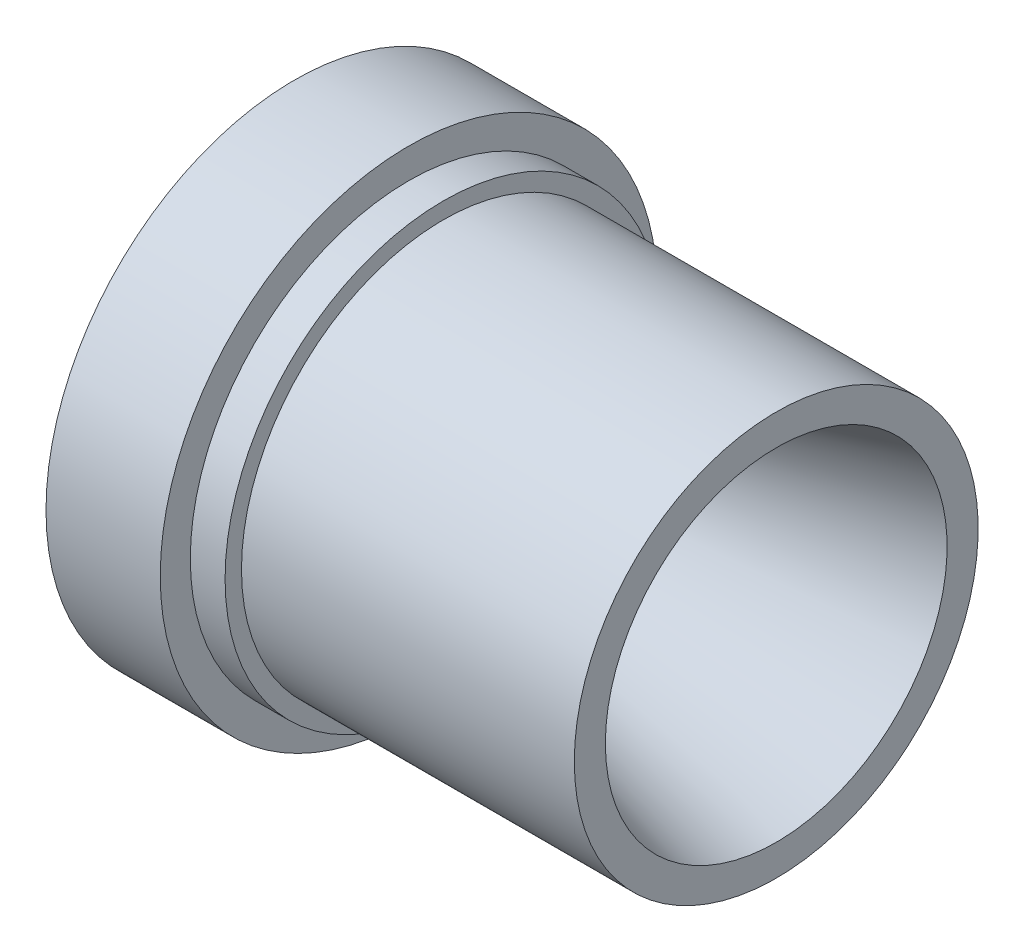
ISO-10303-21;
HEADER;
FILE_DESCRIPTION(('STEP AP214'),'2;1');
FILE_NAME('part.step','',(''),(''),'','','');
FILE_SCHEMA(('AUTOMOTIVE_DESIGN { 1 0 10303 214 1 1 1 1 }'));
ENDSEC;
DATA;
#1=APPLICATION_CONTEXT('core data for automotive mechanical design processes');
#2=APPLICATION_PROTOCOL_DEFINITION('international standard','automotive_design',2000,#1);
#3=PRODUCT_CONTEXT('',#1,'mechanical');
#4=PRODUCT('Part','Part','',(#3));
#5=PRODUCT_RELATED_PRODUCT_CATEGORY('part','',(#4));
#6=PRODUCT_DEFINITION_FORMATION('','',#4);
#7=PRODUCT_DEFINITION_CONTEXT('part definition',#1,'design');
#8=PRODUCT_DEFINITION('design','',#6,#7);
#9=PRODUCT_DEFINITION_SHAPE('','',#8);
#10=(LENGTH_UNIT() NAMED_UNIT(*) SI_UNIT(.MILLI.,.METRE.));
#11=(NAMED_UNIT(*) PLANE_ANGLE_UNIT() SI_UNIT($,.RADIAN.));
#12=(NAMED_UNIT(*) SI_UNIT($,.STERADIAN.) SOLID_ANGLE_UNIT());
#13=UNCERTAINTY_MEASURE_WITH_UNIT(LENGTH_MEASURE(1.E-05),#10,'distance_accuracy_value','');
#14=(GEOMETRIC_REPRESENTATION_CONTEXT(3) GLOBAL_UNCERTAINTY_ASSIGNED_CONTEXT((#13)) GLOBAL_UNIT_ASSIGNED_CONTEXT((#10,
#11,#12)) REPRESENTATION_CONTEXT('',''));
#15=CARTESIAN_POINT('',(0.,0.,0.));
#16=DIRECTION('',(0.,0.,1.));
#17=DIRECTION('',(1.,0.,0.));
#18=AXIS2_PLACEMENT_3D('',#15,#16,#17);
#19=CARTESIAN_POINT('',(0.,0.,0.));
#20=DIRECTION('',(-1.,0.,0.));
#21=DIRECTION('',(0.,0.,1.));
#22=AXIS2_PLACEMENT_3D('',#19,#20,#21);
#23=CYLINDRICAL_SURFACE('',#22,3.6957);
#24=CARTESIAN_POINT('',(0.,0.,0.));
#25=DIRECTION('',(-1.,0.,0.));
#26=DIRECTION('',(0.,0.,1.));
#27=AXIS2_PLACEMENT_3D('',#24,#25,#26);
#28=CIRCLE('',#27,3.6957);
#29=CARTESIAN_POINT('',(0.,0.,3.6957));
#30=VERTEX_POINT('',#29);
#31=EDGE_CURVE('E10',#30,#30,#28,.T.);
#32=ORIENTED_EDGE('',*,*,#31,.F.);
#33=EDGE_LOOP('',(#32));
#34=FACE_BOUND('',#33,.T.);
#35=CARTESIAN_POINT('',(-1.57957303331795,0.,0.));
#36=DIRECTION('',(-1.,0.,0.));
#37=DIRECTION('',(0.,0.,1.));
#38=AXIS2_PLACEMENT_3D('',#35,#36,#37);
#39=CIRCLE('',#38,3.6957);
#40=CARTESIAN_POINT('',(-1.57957303331795,0.,3.6957));
#41=VERTEX_POINT('',#40);
#42=EDGE_CURVE('E68',#41,#41,#39,.T.);
#43=ORIENTED_EDGE('',*,*,#42,.T.);
#44=EDGE_LOOP('',(#43));
#45=FACE_BOUND('',#44,.T.);
#46=ADVANCED_FACE('F34',(#34,#45),#23,.F.);
#47=CARTESIAN_POINT('',(0.,0.,0.));
#48=DIRECTION('',(1.,0.,0.));
#49=DIRECTION('',(0.,0.,-1.));
#50=AXIS2_PLACEMENT_3D('',#47,#48,#49);
#51=CONICAL_SURFACE('',#50,3.6957,0.261799387799143);
#52=CARTESIAN_POINT('',(18.816626966682,0.,0.));
#53=DIRECTION('',(-1.,0.,0.));
#54=DIRECTION('',(0.,0.,1.));
#55=AXIS2_PLACEMENT_3D('',#52,#53,#54);
#56=CIRCLE('',#55,8.7376);
#57=CARTESIAN_POINT('',(18.816626966682,0.,8.7376));
#58=VERTEX_POINT('',#57);
#59=EDGE_CURVE('E40',#58,#58,#56,.T.);
#60=ORIENTED_EDGE('',*,*,#59,.F.);
#61=EDGE_LOOP('',(#60));
#62=FACE_BOUND('',#61,.T.);
#63=ORIENTED_EDGE('',*,*,#31,.T.);
#64=EDGE_LOOP('',(#63));
#65=FACE_BOUND('',#64,.T.);
#66=ADVANCED_FACE('F117',(#62,#65),#51,.F.);
#67=CARTESIAN_POINT('',(18.816626966682,8.7376,0.));
#68=DIRECTION('',(-1.,0.,0.));
#69=DIRECTION('',(0.,0.,1.));
#70=AXIS2_PLACEMENT_3D('',#67,#68,#69);
#71=PLANE('',#70);
#72=CARTESIAN_POINT('',(18.816626966682,0.,0.));
#73=DIRECTION('',(-1.,0.,0.));
#74=DIRECTION('',(0.,0.,1.));
#75=AXIS2_PLACEMENT_3D('',#72,#73,#74);
#76=CIRCLE('',#75,10.3251);
#77=CARTESIAN_POINT('',(18.816626966682,0.,10.3251));
#78=VERTEX_POINT('',#77);
#79=EDGE_CURVE('E44',#78,#78,#76,.T.);
#80=ORIENTED_EDGE('',*,*,#79,.F.);
#81=EDGE_LOOP('',(#80));
#82=FACE_BOUND('',#81,.T.);
#83=ORIENTED_EDGE('',*,*,#59,.T.);
#84=EDGE_LOOP('',(#83));
#85=FACE_BOUND('',#84,.T.);
#86=ADVANCED_FACE('F112',(#82,#85),#71,.F.);
#87=CARTESIAN_POINT('',(0.,0.,0.));
#88=DIRECTION('',(-1.,0.,0.));
#89=DIRECTION('',(0.,0.,1.));
#90=AXIS2_PLACEMENT_3D('',#87,#88,#89);
#91=CYLINDRICAL_SURFACE('',#90,10.3251);
#92=CARTESIAN_POINT('',(1.79862696668201,0.,0.));
#93=DIRECTION('',(-1.,0.,0.));
#94=DIRECTION('',(0.,0.,1.));
#95=AXIS2_PLACEMENT_3D('',#92,#93,#94);
#96=CIRCLE('',#95,10.3251);
#97=CARTESIAN_POINT('',(1.79862696668201,0.,10.3251));
#98=VERTEX_POINT('',#97);
#99=EDGE_CURVE('E48',#98,#98,#96,.T.);
#100=ORIENTED_EDGE('',*,*,#99,.F.);
#101=EDGE_LOOP('',(#100));
#102=FACE_BOUND('',#101,.T.);
#103=ORIENTED_EDGE('',*,*,#79,.T.);
#104=EDGE_LOOP('',(#103));
#105=FACE_BOUND('',#104,.T.);
#106=ADVANCED_FACE('F106',(#102,#105),#91,.T.);
#107=CARTESIAN_POINT('',(1.79862696668201,10.3251,0.));
#108=DIRECTION('',(-1.,0.,0.));
#109=DIRECTION('',(0.,0.,1.));
#110=AXIS2_PLACEMENT_3D('',#107,#108,#109);
#111=PLANE('',#110);
#112=CARTESIAN_POINT('',(1.79862696668201,0.,0.));
#113=DIRECTION('',(-1.,0.,0.));
#114=DIRECTION('',(0.,0.,1.));
#115=AXIS2_PLACEMENT_3D('',#112,#113,#114);
#116=CIRCLE('',#115,11.1633);
#117=CARTESIAN_POINT('',(1.79862696668201,0.,11.1633));
#118=VERTEX_POINT('',#117);
#119=EDGE_CURVE('E53',#118,#118,#116,.T.);
#120=ORIENTED_EDGE('',*,*,#119,.F.);
#121=EDGE_LOOP('',(#120));
#122=FACE_BOUND('',#121,.T.);
#123=ORIENTED_EDGE('',*,*,#99,.T.);
#124=EDGE_LOOP('',(#123));
#125=FACE_BOUND('',#124,.T.);
#126=ADVANCED_FACE('F100',(#122,#125),#111,.F.);
#127=CARTESIAN_POINT('',(0.,0.,0.));
#128=DIRECTION('',(-1.,0.,0.));
#129=DIRECTION('',(0.,0.,1.));
#130=AXIS2_PLACEMENT_3D('',#127,#128,#129);
#131=CYLINDRICAL_SURFACE('',#130,11.1633);
#132=CARTESIAN_POINT('',(0.0206269666820098,0.,0.));
#133=DIRECTION('',(-1.,0.,0.));
#134=DIRECTION('',(0.,0.,1.));
#135=AXIS2_PLACEMENT_3D('',#132,#133,#134);
#136=CIRCLE('',#135,11.1633);
#137=CARTESIAN_POINT('',(0.0206269666820098,0.,11.1633));
#138=VERTEX_POINT('',#137);
#139=EDGE_CURVE('E56',#138,#138,#136,.T.);
#140=ORIENTED_EDGE('',*,*,#139,.F.);
#141=EDGE_LOOP('',(#140));
#142=FACE_BOUND('',#141,.T.);
#143=ORIENTED_EDGE('',*,*,#119,.T.);
#144=EDGE_LOOP('',(#143));
#145=FACE_BOUND('',#144,.T.);
#146=ADVANCED_FACE('F94',(#142,#145),#131,.T.);
#147=CARTESIAN_POINT('',(0.0206269666820098,11.1633,0.));
#148=DIRECTION('',(-1.,0.,0.));
#149=DIRECTION('',(0.,0.,1.));
#150=AXIS2_PLACEMENT_3D('',#147,#148,#149);
#151=PLANE('',#150);
#152=CARTESIAN_POINT('',(0.0206269666820098,0.,0.));
#153=DIRECTION('',(-1.,0.,0.));
#154=DIRECTION('',(0.,0.,1.));
#155=AXIS2_PLACEMENT_3D('',#152,#153,#154);
#156=CIRCLE('',#155,12.7);
#157=CARTESIAN_POINT('',(0.0206269666820098,0.,12.7));
#158=VERTEX_POINT('',#157);
#159=EDGE_CURVE('E59',#158,#158,#156,.T.);
#160=ORIENTED_EDGE('',*,*,#159,.F.);
#161=EDGE_LOOP('',(#160));
#162=FACE_BOUND('',#161,.T.);
#163=ORIENTED_EDGE('',*,*,#139,.T.);
#164=EDGE_LOOP('',(#163));
#165=FACE_BOUND('',#164,.T.);
#166=ADVANCED_FACE('F88',(#162,#165),#151,.F.);
#167=CARTESIAN_POINT('',(0.,0.,0.));
#168=DIRECTION('',(-1.,0.,0.));
#169=DIRECTION('',(0.,0.,1.));
#170=AXIS2_PLACEMENT_3D('',#167,#168,#169);
#171=CYLINDRICAL_SURFACE('',#170,12.7);
#172=CARTESIAN_POINT('',(-5.82137303331799,0.,0.));
#173=DIRECTION('',(-1.,0.,0.));
#174=DIRECTION('',(0.,0.,1.));
#175=AXIS2_PLACEMENT_3D('',#172,#173,#174);
#176=CIRCLE('',#175,12.7);
#177=CARTESIAN_POINT('',(-5.82137303331799,0.,12.7));
#178=VERTEX_POINT('',#177);
#179=EDGE_CURVE('E62',#178,#178,#176,.T.);
#180=ORIENTED_EDGE('',*,*,#179,.F.);
#181=EDGE_LOOP('',(#180));
#182=FACE_BOUND('',#181,.T.);
#183=ORIENTED_EDGE('',*,*,#159,.T.);
#184=EDGE_LOOP('',(#183));
#185=FACE_BOUND('',#184,.T.);
#186=ADVANCED_FACE('F82',(#182,#185),#171,.T.);
#187=CARTESIAN_POINT('',(-5.82137303331799,12.7,0.));
#188=DIRECTION('',(1.,0.,0.));
#189=DIRECTION('',(0.,0.,-1.));
#190=AXIS2_PLACEMENT_3D('',#187,#188,#189);
#191=PLANE('',#190);
#192=CARTESIAN_POINT('',(-5.82137303331799,0.,0.));
#193=DIRECTION('',(-1.,0.,0.));
#194=DIRECTION('',(0.,0.,1.));
#195=AXIS2_PLACEMENT_3D('',#192,#193,#194);
#196=CIRCLE('',#195,7.9375);
#197=CARTESIAN_POINT('',(-5.82137303331799,0.,7.9375));
#198=VERTEX_POINT('',#197);
#199=EDGE_CURVE('E65',#198,#198,#196,.T.);
#200=ORIENTED_EDGE('',*,*,#199,.F.);
#201=EDGE_LOOP('',(#200));
#202=FACE_BOUND('',#201,.T.);
#203=ORIENTED_EDGE('',*,*,#179,.T.);
#204=EDGE_LOOP('',(#203));
#205=FACE_BOUND('',#204,.T.);
#206=ADVANCED_FACE('F76',(#202,#205),#191,.F.);
#207=CARTESIAN_POINT('',(-5.82137303331799,0.,0.));
#208=DIRECTION('',(-1.,0.,0.));
#209=DIRECTION('',(0.,0.,1.));
#210=AXIS2_PLACEMENT_3D('',#207,#208,#209);
#211=CONICAL_SURFACE('',#210,7.9375,0.785398163397444);
#212=ORIENTED_EDGE('',*,*,#42,.F.);
#213=EDGE_LOOP('',(#212));
#214=FACE_BOUND('',#213,.T.);
#215=ORIENTED_EDGE('',*,*,#199,.T.);
#216=EDGE_LOOP('',(#215));
#217=FACE_BOUND('',#216,.T.);
#218=ADVANCED_FACE('F73',(#214,#217),#211,.F.);
#219=CLOSED_SHELL('',(#46,#66,#86,#106,#126,#146,#166,#186,#206,#218));
#220=MANIFOLD_SOLID_BREP('B2',#219);
#221=ADVANCED_BREP_SHAPE_REPRESENTATION('',(#18,#220),#14);
#222=SHAPE_DEFINITION_REPRESENTATION(#9,#221);
ENDSEC;
END-ISO-10303-21;
